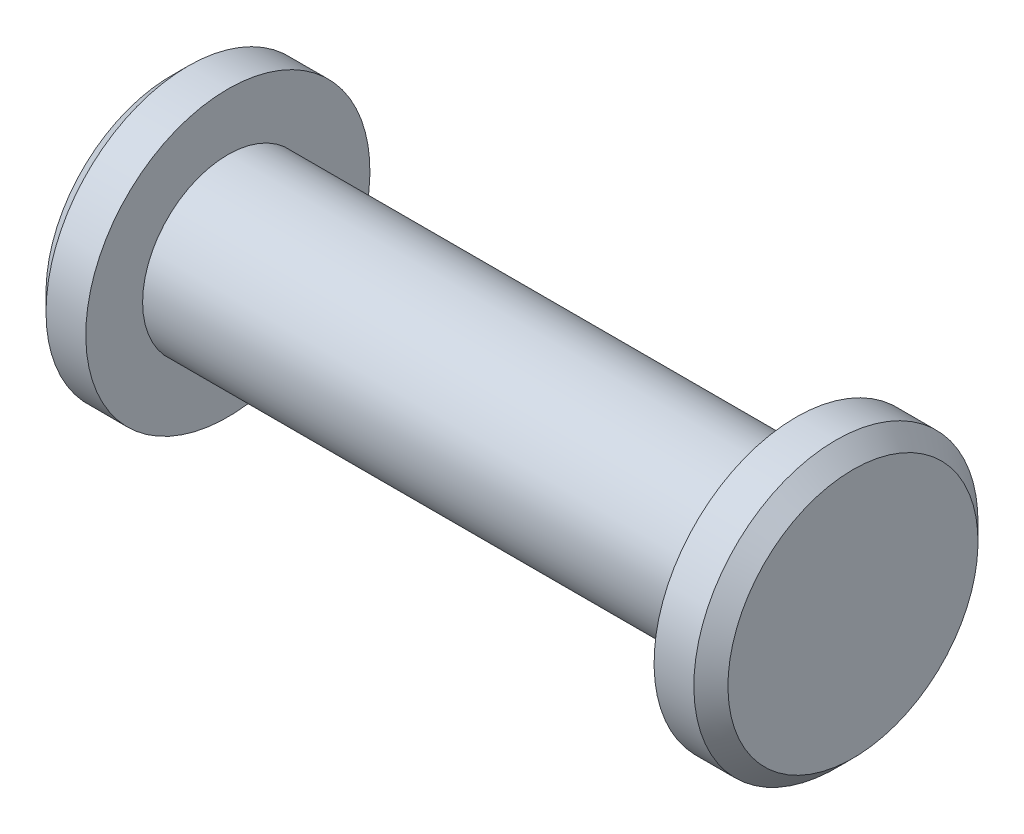
ISO-10303-21;
HEADER;
FILE_DESCRIPTION(('STEP AP214'),'2;1');
FILE_NAME('part.step','',(''),(''),'','','');
FILE_SCHEMA(('AUTOMOTIVE_DESIGN { 1 0 10303 214 1 1 1 1 }'));
ENDSEC;
DATA;
#1=APPLICATION_CONTEXT('core data for automotive mechanical design processes');
#2=APPLICATION_PROTOCOL_DEFINITION('international standard','automotive_design',2000,#1);
#3=PRODUCT_CONTEXT('',#1,'mechanical');
#4=PRODUCT('Part','Part','',(#3));
#5=PRODUCT_RELATED_PRODUCT_CATEGORY('part','',(#4));
#6=PRODUCT_DEFINITION_FORMATION('','',#4);
#7=PRODUCT_DEFINITION_CONTEXT('part definition',#1,'design');
#8=PRODUCT_DEFINITION('design','',#6,#7);
#9=PRODUCT_DEFINITION_SHAPE('','',#8);
#10=(LENGTH_UNIT() NAMED_UNIT(*) SI_UNIT(.MILLI.,.METRE.));
#11=(NAMED_UNIT(*) PLANE_ANGLE_UNIT() SI_UNIT($,.RADIAN.));
#12=(NAMED_UNIT(*) SI_UNIT($,.STERADIAN.) SOLID_ANGLE_UNIT());
#13=UNCERTAINTY_MEASURE_WITH_UNIT(LENGTH_MEASURE(1.E-05),#10,'distance_accuracy_value','');
#14=(GEOMETRIC_REPRESENTATION_CONTEXT(3) GLOBAL_UNCERTAINTY_ASSIGNED_CONTEXT((#13)) GLOBAL_UNIT_ASSIGNED_CONTEXT((#10,
#11,#12)) REPRESENTATION_CONTEXT('',''));
#15=CARTESIAN_POINT('',(0.,0.,0.));
#16=DIRECTION('',(0.,0.,1.));
#17=DIRECTION('',(1.,0.,0.));
#18=AXIS2_PLACEMENT_3D('',#15,#16,#17);
#19=CARTESIAN_POINT('',(0.,25.,0.));
#20=DIRECTION('',(1.,0.,0.));
#21=DIRECTION('',(0.,1.,0.));
#22=AXIS2_PLACEMENT_3D('',#19,#20,#21);
#23=PLANE('',#22);
#24=CARTESIAN_POINT('',(0.,0.,0.));
#25=DIRECTION('',(1.,0.,0.));
#26=DIRECTION('',(0.,1.,0.));
#27=AXIS2_PLACEMENT_3D('',#24,#25,#26);
#28=CIRCLE('',#27,22.0000000000001);
#29=CARTESIAN_POINT('',(0.,22.0000000000001,0.));
#30=VERTEX_POINT('',#29);
#31=EDGE_CURVE('E50',#30,#30,#28,.T.);
#32=ORIENTED_EDGE('',*,*,#31,.T.);
#33=EDGE_LOOP('',(#32));
#34=FACE_BOUND('',#33,.T.);
#35=ADVANCED_FACE('F41',(#34),#23,.T.);
#36=CARTESIAN_POINT('',(-120.,0.,0.));
#37=DIRECTION('',(-1.,0.,0.));
#38=DIRECTION('',(0.,-1.,0.));
#39=AXIS2_PLACEMENT_3D('',#36,#37,#38);
#40=PLANE('',#39);
#41=CARTESIAN_POINT('',(-120.,0.,0.));
#42=DIRECTION('',(-1.,0.,0.));
#43=DIRECTION('',(0.,-1.,0.));
#44=AXIS2_PLACEMENT_3D('',#41,#42,#43);
#45=CIRCLE('',#44,22.);
#46=CARTESIAN_POINT('',(-120.,-22.,0.));
#47=VERTEX_POINT('',#46);
#48=EDGE_CURVE('E55',#47,#47,#45,.T.);
#49=ORIENTED_EDGE('',*,*,#48,.T.);
#50=EDGE_LOOP('',(#49));
#51=FACE_BOUND('',#50,.T.);
#52=ADVANCED_FACE('F100',(#51),#40,.T.);
#53=CARTESIAN_POINT('',(0.,0.,0.));
#54=DIRECTION('',(1.,0.,0.));
#55=DIRECTION('',(0.,1.,0.));
#56=AXIS2_PLACEMENT_3D('',#53,#54,#55);
#57=CYLINDRICAL_SURFACE('',#56,25.);
#58=CARTESIAN_POINT('',(-117.,0.,0.));
#59=DIRECTION('',(-1.,0.,0.));
#60=DIRECTION('',(0.,-1.,0.));
#61=AXIS2_PLACEMENT_3D('',#58,#59,#60);
#62=CIRCLE('',#61,25.);
#63=CARTESIAN_POINT('',(-117.,-25.,0.));
#64=VERTEX_POINT('',#63);
#65=EDGE_CURVE('E60',#64,#64,#62,.F.);
#66=ORIENTED_EDGE('',*,*,#65,.T.);
#67=EDGE_LOOP('',(#66));
#68=FACE_BOUND('',#67,.T.);
#69=CARTESIAN_POINT('',(-110.,0.,0.));
#70=DIRECTION('',(1.,0.,0.));
#71=DIRECTION('',(0.,1.,0.));
#72=AXIS2_PLACEMENT_3D('',#69,#70,#71);
#73=CIRCLE('',#72,25.);
#74=CARTESIAN_POINT('',(-110.,25.,0.));
#75=VERTEX_POINT('',#74);
#76=EDGE_CURVE('E66',#75,#75,#73,.T.);
#77=ORIENTED_EDGE('',*,*,#76,.F.);
#78=EDGE_LOOP('',(#77));
#79=FACE_BOUND('',#78,.T.);
#80=ADVANCED_FACE('F105',(#68,#79),#57,.T.);
#81=CARTESIAN_POINT('',(-110.,25.,0.));
#82=DIRECTION('',(1.,0.,0.));
#83=DIRECTION('',(0.,1.,0.));
#84=AXIS2_PLACEMENT_3D('',#81,#82,#83);
#85=PLANE('',#84);
#86=ORIENTED_EDGE('',*,*,#76,.T.);
#87=EDGE_LOOP('',(#86));
#88=FACE_BOUND('',#87,.T.);
#89=CARTESIAN_POINT('',(-110.,0.,0.));
#90=DIRECTION('',(1.,0.,0.));
#91=DIRECTION('',(0.,1.,0.));
#92=AXIS2_PLACEMENT_3D('',#89,#90,#91);
#93=CIRCLE('',#92,15.);
#94=CARTESIAN_POINT('',(-110.,15.,0.));
#95=VERTEX_POINT('',#94);
#96=EDGE_CURVE('E70',#95,#95,#93,.T.);
#97=ORIENTED_EDGE('',*,*,#96,.F.);
#98=EDGE_LOOP('',(#97));
#99=FACE_BOUND('',#98,.T.);
#100=ADVANCED_FACE('F96',(#88,#99),#85,.T.);
#101=CARTESIAN_POINT('',(0.,0.,0.));
#102=DIRECTION('',(1.,0.,0.));
#103=DIRECTION('',(0.,1.,0.));
#104=AXIS2_PLACEMENT_3D('',#101,#102,#103);
#105=CYLINDRICAL_SURFACE('',#104,15.);
#106=ORIENTED_EDGE('',*,*,#96,.T.);
#107=EDGE_LOOP('',(#106));
#108=FACE_BOUND('',#107,.T.);
#109=CARTESIAN_POINT('',(-10.,0.,0.));
#110=DIRECTION('',(1.,0.,0.));
#111=DIRECTION('',(0.,1.,0.));
#112=AXIS2_PLACEMENT_3D('',#109,#110,#111);
#113=CIRCLE('',#112,15.);
#114=CARTESIAN_POINT('',(-10.,15.,0.));
#115=VERTEX_POINT('',#114);
#116=EDGE_CURVE('E74',#115,#115,#113,.T.);
#117=ORIENTED_EDGE('',*,*,#116,.F.);
#118=EDGE_LOOP('',(#117));
#119=FACE_BOUND('',#118,.T.);
#120=ADVANCED_FACE('F87',(#108,#119),#105,.T.);
#121=CARTESIAN_POINT('',(-10.,15.,0.));
#122=DIRECTION('',(-1.,0.,0.));
#123=DIRECTION('',(0.,-1.,0.));
#124=AXIS2_PLACEMENT_3D('',#121,#122,#123);
#125=PLANE('',#124);
#126=ORIENTED_EDGE('',*,*,#116,.T.);
#127=EDGE_LOOP('',(#126));
#128=FACE_BOUND('',#127,.T.);
#129=CARTESIAN_POINT('',(-9.99999999999999,0.,0.));
#130=DIRECTION('',(1.,0.,0.));
#131=DIRECTION('',(0.,1.,0.));
#132=AXIS2_PLACEMENT_3D('',#129,#130,#131);
#133=CIRCLE('',#132,25.);
#134=CARTESIAN_POINT('',(-10.,25.,0.));
#135=VERTEX_POINT('',#134);
#136=EDGE_CURVE('E78',#135,#135,#133,.T.);
#137=ORIENTED_EDGE('',*,*,#136,.F.);
#138=EDGE_LOOP('',(#137));
#139=FACE_BOUND('',#138,.T.);
#140=ADVANCED_FACE('F85',(#128,#139),#125,.T.);
#141=CARTESIAN_POINT('',(0.,0.,0.));
#142=DIRECTION('',(1.,0.,0.));
#143=DIRECTION('',(0.,1.,0.));
#144=AXIS2_PLACEMENT_3D('',#141,#142,#143);
#145=CYLINDRICAL_SURFACE('',#144,25.);
#146=CARTESIAN_POINT('',(-2.99999999999995,0.,0.));
#147=DIRECTION('',(1.,0.,0.));
#148=DIRECTION('',(0.,1.,0.));
#149=AXIS2_PLACEMENT_3D('',#146,#147,#148);
#150=CIRCLE('',#149,25.);
#151=CARTESIAN_POINT('',(-2.99999999999995,25.,0.));
#152=VERTEX_POINT('',#151);
#153=EDGE_CURVE('E10',#152,#152,#150,.F.);
#154=ORIENTED_EDGE('',*,*,#153,.T.);
#155=EDGE_LOOP('',(#154));
#156=FACE_BOUND('',#155,.T.);
#157=ORIENTED_EDGE('',*,*,#136,.T.);
#158=EDGE_LOOP('',(#157));
#159=FACE_BOUND('',#158,.T.);
#160=ADVANCED_FACE('F83',(#156,#159),#145,.T.);
#161=CARTESIAN_POINT('',(-117.,0.,0.));
#162=DIRECTION('',(1.,0.,0.));
#163=DIRECTION('',(0.,1.,0.));
#164=AXIS2_PLACEMENT_3D('',#161,#162,#163);
#165=CONICAL_SURFACE('',#164,25.,0.78539816339745);
#166=ORIENTED_EDGE('',*,*,#48,.F.);
#167=EDGE_LOOP('',(#166));
#168=FACE_BOUND('',#167,.T.);
#169=ORIENTED_EDGE('',*,*,#65,.F.);
#170=EDGE_LOOP('',(#169));
#171=FACE_BOUND('',#170,.T.);
#172=ADVANCED_FACE('F94',(#168,#171),#165,.T.);
#173=CARTESIAN_POINT('',(0.,0.,0.));
#174=DIRECTION('',(-1.,0.,0.));
#175=DIRECTION('',(0.,-1.,0.));
#176=AXIS2_PLACEMENT_3D('',#173,#174,#175);
#177=CONICAL_SURFACE('',#176,22.0000000000001,0.785398163397448);
#178=ORIENTED_EDGE('',*,*,#153,.F.);
#179=EDGE_LOOP('',(#178));
#180=FACE_BOUND('',#179,.T.);
#181=ORIENTED_EDGE('',*,*,#31,.F.);
#182=EDGE_LOOP('',(#181));
#183=FACE_BOUND('',#182,.T.);
#184=ADVANCED_FACE('F44',(#180,#183),#177,.T.);
#185=CLOSED_SHELL('',(#35,#52,#80,#100,#120,#140,#160,#172,#184));
#186=MANIFOLD_SOLID_BREP('B2',#185);
#187=ADVANCED_BREP_SHAPE_REPRESENTATION('',(#18,#186),#14);
#188=SHAPE_DEFINITION_REPRESENTATION(#9,#187);
ENDSEC;
END-ISO-10303-21;
